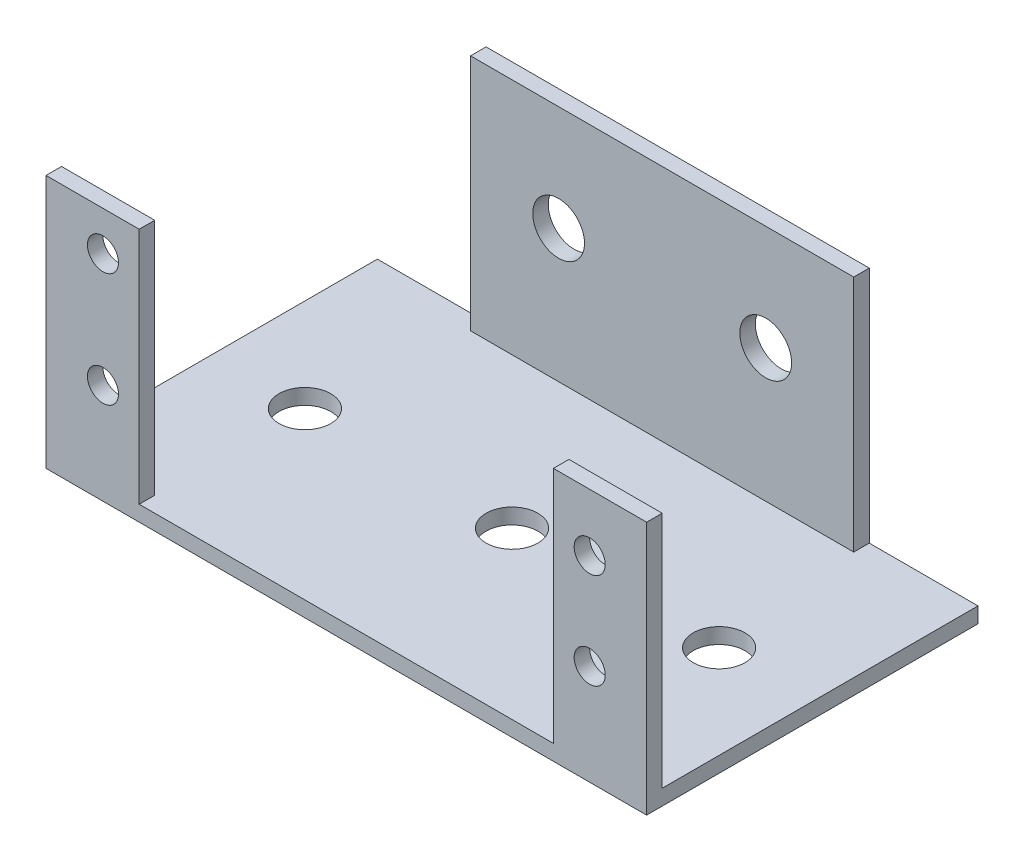
ISO-10303-21;
HEADER;
FILE_DESCRIPTION(('STEP AP214'),'2;1');
FILE_NAME('part.step','',(''),(''),'','','');
FILE_SCHEMA(('AUTOMOTIVE_DESIGN { 1 0 10303 214 1 1 1 1 }'));
ENDSEC;
DATA;
#1=APPLICATION_CONTEXT('core data for automotive mechanical design processes');
#2=APPLICATION_PROTOCOL_DEFINITION('international standard','automotive_design',2000,#1);
#3=PRODUCT_CONTEXT('',#1,'mechanical');
#4=PRODUCT('Part','Part','',(#3));
#5=PRODUCT_RELATED_PRODUCT_CATEGORY('part','',(#4));
#6=PRODUCT_DEFINITION_FORMATION('','',#4);
#7=PRODUCT_DEFINITION_CONTEXT('part definition',#1,'design');
#8=PRODUCT_DEFINITION('design','',#6,#7);
#9=PRODUCT_DEFINITION_SHAPE('','',#8);
#10=(LENGTH_UNIT() NAMED_UNIT(*) SI_UNIT(.MILLI.,.METRE.));
#11=(NAMED_UNIT(*) PLANE_ANGLE_UNIT() SI_UNIT($,.RADIAN.));
#12=(NAMED_UNIT(*) SI_UNIT($,.STERADIAN.) SOLID_ANGLE_UNIT());
#13=UNCERTAINTY_MEASURE_WITH_UNIT(LENGTH_MEASURE(1.E-05),#10,'distance_accuracy_value','');
#14=(GEOMETRIC_REPRESENTATION_CONTEXT(3) GLOBAL_UNCERTAINTY_ASSIGNED_CONTEXT((#13)) GLOBAL_UNIT_ASSIGNED_CONTEXT((#10,
#11,#12)) REPRESENTATION_CONTEXT('',''));
#15=CARTESIAN_POINT('',(0.,0.,0.));
#16=DIRECTION('',(0.,0.,1.));
#17=DIRECTION('',(1.,0.,0.));
#18=AXIS2_PLACEMENT_3D('',#15,#16,#17);
#19=CARTESIAN_POINT('',(0.,0.,0.));
#20=DIRECTION('',(0.,1.,0.));
#21=DIRECTION('',(0.,0.,1.));
#22=AXIS2_PLACEMENT_3D('',#19,#20,#21);
#23=PLANE('',#22);
#24=CARTESIAN_POINT('',(20.,0.,0.));
#25=DIRECTION('',(0.,1.,0.));
#26=DIRECTION('',(0.,0.,1.));
#27=AXIS2_PLACEMENT_3D('',#24,#25,#26);
#28=CIRCLE('',#27,2.5);
#29=CARTESIAN_POINT('',(20.,0.,2.5));
#30=VERTEX_POINT('',#29);
#31=EDGE_CURVE('E305',#30,#30,#28,.T.);
#32=ORIENTED_EDGE('',*,*,#31,.F.);
#33=EDGE_LOOP('',(#32));
#34=FACE_BOUND('',#33,.T.);
#35=CARTESIAN_POINT('',(0.,0.,0.));
#36=DIRECTION('',(0.,1.,0.));
#37=DIRECTION('',(0.,0.,1.));
#38=AXIS2_PLACEMENT_3D('',#35,#36,#37);
#39=CIRCLE('',#38,2.5);
#40=CARTESIAN_POINT('',(0.,0.,2.5));
#41=VERTEX_POINT('',#40);
#42=EDGE_CURVE('E562',#41,#41,#39,.T.);
#43=ORIENTED_EDGE('',*,*,#42,.F.);
#44=EDGE_LOOP('',(#43));
#45=FACE_BOUND('',#44,.T.);
#46=CARTESIAN_POINT('',(-20.,0.,0.));
#47=DIRECTION('',(0.,1.,0.));
#48=DIRECTION('',(0.,0.,1.));
#49=AXIS2_PLACEMENT_3D('',#46,#47,#48);
#50=CIRCLE('',#49,2.5);
#51=CARTESIAN_POINT('',(-20.,0.,2.5));
#52=VERTEX_POINT('',#51);
#53=EDGE_CURVE('E565',#52,#52,#50,.T.);
#54=ORIENTED_EDGE('',*,*,#53,.F.);
#55=EDGE_LOOP('',(#54));
#56=FACE_BOUND('',#55,.T.);
#57=DIRECTION('',(-1.,0.,0.));
#58=VECTOR('',#57,1.);
#59=CARTESIAN_POINT('',(0.,0.,-14.5));
#60=LINE('',#59,#58);
#61=CARTESIAN_POINT('',(18.5,0.,-14.5));
#62=VERTEX_POINT('',#61);
#63=CARTESIAN_POINT('',(-18.5,0.,-14.5));
#64=VERTEX_POINT('',#63);
#65=EDGE_CURVE('E88',#62,#64,#60,.T.);
#66=ORIENTED_EDGE('',*,*,#65,.T.);
#67=DIRECTION('',(0.,0.,1.));
#68=VECTOR('',#67,1.);
#69=CARTESIAN_POINT('',(-18.5,0.,0.));
#70=LINE('',#69,#68);
#71=CARTESIAN_POINT('',(-18.5,0.,-16.));
#72=VERTEX_POINT('',#71);
#73=EDGE_CURVE('E326',#72,#64,#70,.T.);
#74=ORIENTED_EDGE('',*,*,#73,.F.);
#75=DIRECTION('',(-1.,0.,0.));
#76=VECTOR('',#75,1.);
#77=CARTESIAN_POINT('',(0.,0.,-16.));
#78=LINE('',#77,#76);
#79=CARTESIAN_POINT('',(-29.,0.,-16.));
#80=VERTEX_POINT('',#79);
#81=EDGE_CURVE('E197',#72,#80,#78,.T.);
#82=ORIENTED_EDGE('',*,*,#81,.T.);
#83=DIRECTION('',(0.,0.,1.));
#84=VECTOR('',#83,1.);
#85=CARTESIAN_POINT('',(-29.,0.,0.));
#86=LINE('',#85,#84);
#87=CARTESIAN_POINT('',(-29.,0.,14.5));
#88=VERTEX_POINT('',#87);
#89=EDGE_CURVE('E285',#80,#88,#86,.T.);
#90=ORIENTED_EDGE('',*,*,#89,.T.);
#91=DIRECTION('',(1.,0.,0.));
#92=VECTOR('',#91,1.);
#93=CARTESIAN_POINT('',(0.,0.,14.5));
#94=LINE('',#93,#92);
#95=CARTESIAN_POINT('',(-20.,0.,14.5));
#96=VERTEX_POINT('',#95);
#97=EDGE_CURVE('E245',#88,#96,#94,.T.);
#98=ORIENTED_EDGE('',*,*,#97,.T.);
#99=DIRECTION('',(0.,0.,1.));
#100=VECTOR('',#99,1.);
#101=CARTESIAN_POINT('',(-20.,0.,0.));
#102=LINE('',#101,#100);
#103=CARTESIAN_POINT('',(-20.,0.,16.));
#104=VERTEX_POINT('',#103);
#105=EDGE_CURVE('E240',#96,#104,#102,.T.);
#106=ORIENTED_EDGE('',*,*,#105,.T.);
#107=DIRECTION('',(-1.,0.,0.));
#108=VECTOR('',#107,1.);
#109=CARTESIAN_POINT('',(0.,0.,16.));
#110=LINE('',#109,#108);
#111=CARTESIAN_POINT('',(20.,0.,16.));
#112=VERTEX_POINT('',#111);
#113=EDGE_CURVE('E271',#112,#104,#110,.T.);
#114=ORIENTED_EDGE('',*,*,#113,.F.);
#115=DIRECTION('',(0.,0.,1.));
#116=VECTOR('',#115,1.);
#117=CARTESIAN_POINT('',(20.,0.,0.));
#118=LINE('',#117,#116);
#119=CARTESIAN_POINT('',(20.,0.,14.5));
#120=VERTEX_POINT('',#119);
#121=EDGE_CURVE('E220',#120,#112,#118,.T.);
#122=ORIENTED_EDGE('',*,*,#121,.F.);
#123=DIRECTION('',(1.,0.,0.));
#124=VECTOR('',#123,1.);
#125=CARTESIAN_POINT('',(0.,0.,14.5));
#126=LINE('',#125,#124);
#127=CARTESIAN_POINT('',(29.,0.,14.5));
#128=VERTEX_POINT('',#127);
#129=EDGE_CURVE('E229',#120,#128,#126,.T.);
#130=ORIENTED_EDGE('',*,*,#129,.T.);
#131=DIRECTION('',(0.,0.,1.));
#132=VECTOR('',#131,1.);
#133=CARTESIAN_POINT('',(29.,0.,0.));
#134=LINE('',#133,#132);
#135=CARTESIAN_POINT('',(29.,0.,-16.));
#136=VERTEX_POINT('',#135);
#137=EDGE_CURVE('E279',#136,#128,#134,.T.);
#138=ORIENTED_EDGE('',*,*,#137,.F.);
#139=CARTESIAN_POINT('',(18.5,0.,-16.));
#140=VERTEX_POINT('',#139);
#141=EDGE_CURVE('E283',#136,#140,#78,.T.);
#142=ORIENTED_EDGE('',*,*,#141,.T.);
#143=DIRECTION('',(0.,0.,1.));
#144=VECTOR('',#143,1.);
#145=CARTESIAN_POINT('',(18.4999999999999,0.,1.28369537222284E-13));
#146=LINE('',#145,#144);
#147=EDGE_CURVE('E93',#140,#62,#146,.T.);
#148=ORIENTED_EDGE('',*,*,#147,.T.);
#149=EDGE_LOOP('',(#66,#74,#82,#90,#98,#106,#114,#122,#130,#138,#142,#148));
#150=FACE_BOUND('',#149,.T.);
#151=ADVANCED_FACE('F71',(#34,#45,#56,#150),#23,.T.);
#152=CARTESIAN_POINT('',(29.,-1.5,0.));
#153=DIRECTION('',(-1.,0.,0.));
#154=DIRECTION('',(0.,0.,1.));
#155=AXIS2_PLACEMENT_3D('',#152,#153,#154);
#156=PLANE('',#155);
#157=ORIENTED_EDGE('',*,*,#137,.T.);
#158=DIRECTION('',(0.,-1.,0.));
#159=VECTOR('',#158,1.);
#160=CARTESIAN_POINT('',(29.,23.,14.5));
#161=LINE('',#160,#159);
#162=CARTESIAN_POINT('',(29.,23.,14.5));
#163=VERTEX_POINT('',#162);
#164=EDGE_CURVE('E228',#163,#128,#161,.T.);
#165=ORIENTED_EDGE('',*,*,#164,.F.);
#166=DIRECTION('',(0.,0.,1.));
#167=VECTOR('',#166,1.);
#168=CARTESIAN_POINT('',(29.,23.,0.));
#169=LINE('',#168,#167);
#170=CARTESIAN_POINT('',(29.,23.,16.));
#171=VERTEX_POINT('',#170);
#172=EDGE_CURVE('E225',#163,#171,#169,.T.);
#173=ORIENTED_EDGE('',*,*,#172,.T.);
#174=DIRECTION('',(0.,1.,0.));
#175=VECTOR('',#174,1.);
#176=CARTESIAN_POINT('',(29.,-1.5,16.));
#177=LINE('',#176,#175);
#178=CARTESIAN_POINT('',(29.,-1.5,16.));
#179=VERTEX_POINT('',#178);
#180=EDGE_CURVE('E266',#179,#171,#177,.T.);
#181=ORIENTED_EDGE('',*,*,#180,.F.);
#182=DIRECTION('',(0.,0.,1.));
#183=VECTOR('',#182,1.);
#184=CARTESIAN_POINT('',(29.,-1.5,0.));
#185=LINE('',#184,#183);
#186=CARTESIAN_POINT('',(29.,-1.5,-16.));
#187=VERTEX_POINT('',#186);
#188=EDGE_CURVE('E267',#187,#179,#185,.T.);
#189=ORIENTED_EDGE('',*,*,#188,.F.);
#190=DIRECTION('',(0.,1.,0.));
#191=VECTOR('',#190,1.);
#192=CARTESIAN_POINT('',(29.,-1.5,-16.));
#193=LINE('',#192,#191);
#194=EDGE_CURVE('E80',#187,#136,#193,.T.);
#195=ORIENTED_EDGE('',*,*,#194,.T.);
#196=EDGE_LOOP('',(#157,#165,#173,#181,#189,#195));
#197=FACE_BOUND('',#196,.T.);
#198=ADVANCED_FACE('F73',(#197),#156,.F.);
#199=CARTESIAN_POINT('',(0.,-1.5,-16.));
#200=DIRECTION('',(0.,0.,-1.));
#201=DIRECTION('',(-1.,0.,0.));
#202=AXIS2_PLACEMENT_3D('',#199,#200,#201);
#203=PLANE('',#202);
#204=CARTESIAN_POINT('',(10.,12.8220392959266,-16.));
#205=DIRECTION('',(0.,0.,1.));
#206=DIRECTION('',(1.,0.,0.));
#207=AXIS2_PLACEMENT_3D('',#204,#205,#206);
#208=CIRCLE('',#207,2.5);
#209=CARTESIAN_POINT('',(12.5,12.8220392959266,-16.));
#210=VERTEX_POINT('',#209);
#211=EDGE_CURVE('E328',#210,#210,#208,.T.);
#212=ORIENTED_EDGE('',*,*,#211,.T.);
#213=EDGE_LOOP('',(#212));
#214=FACE_BOUND('',#213,.T.);
#215=CARTESIAN_POINT('',(-10.,12.8220392959266,-16.));
#216=DIRECTION('',(0.,0.,1.));
#217=DIRECTION('',(-1.,0.,0.));
#218=AXIS2_PLACEMENT_3D('',#215,#216,#217);
#219=CIRCLE('',#218,2.5);
#220=CARTESIAN_POINT('',(-7.5,12.8220392959266,-16.));
#221=VERTEX_POINT('',#220);
#222=EDGE_CURVE('E314',#221,#221,#219,.T.);
#223=ORIENTED_EDGE('',*,*,#222,.T.);
#224=EDGE_LOOP('',(#223));
#225=FACE_BOUND('',#224,.T.);
#226=ORIENTED_EDGE('',*,*,#141,.F.);
#227=ORIENTED_EDGE('',*,*,#194,.F.);
#228=DIRECTION('',(-1.,0.,0.));
#229=VECTOR('',#228,1.);
#230=CARTESIAN_POINT('',(0.,-1.5,-16.));
#231=LINE('',#230,#229);
#232=CARTESIAN_POINT('',(-29.,-1.5,-16.));
#233=VERTEX_POINT('',#232);
#234=EDGE_CURVE('E270',#187,#233,#231,.T.);
#235=ORIENTED_EDGE('',*,*,#234,.T.);
#236=DIRECTION('',(0.,1.,0.));
#237=VECTOR('',#236,1.);
#238=CARTESIAN_POINT('',(-29.,-1.5,-16.));
#239=LINE('',#238,#237);
#240=EDGE_CURVE('E12',#233,#80,#239,.T.);
#241=ORIENTED_EDGE('',*,*,#240,.T.);
#242=ORIENTED_EDGE('',*,*,#81,.F.);
#243=DIRECTION('',(0.,-1.,0.));
#244=VECTOR('',#243,1.);
#245=CARTESIAN_POINT('',(-18.5,23.,-16.));
#246=LINE('',#245,#244);
#247=CARTESIAN_POINT('',(-18.5,23.,-16.));
#248=VERTEX_POINT('',#247);
#249=EDGE_CURVE('E179',#248,#72,#246,.T.);
#250=ORIENTED_EDGE('',*,*,#249,.F.);
#251=DIRECTION('',(-1.,0.,0.));
#252=VECTOR('',#251,1.);
#253=CARTESIAN_POINT('',(0.,23.,-16.));
#254=LINE('',#253,#252);
#255=CARTESIAN_POINT('',(18.5,23.,-16.));
#256=VERTEX_POINT('',#255);
#257=EDGE_CURVE('E185',#256,#248,#254,.T.);
#258=ORIENTED_EDGE('',*,*,#257,.F.);
#259=DIRECTION('',(0.,-1.,0.));
#260=VECTOR('',#259,1.);
#261=CARTESIAN_POINT('',(18.5,23.,-16.));
#262=LINE('',#261,#260);
#263=EDGE_CURVE('E325',#256,#140,#262,.T.);
#264=ORIENTED_EDGE('',*,*,#263,.T.);
#265=EDGE_LOOP('',(#226,#227,#235,#241,#242,#250,#258,#264));
#266=FACE_BOUND('',#265,.T.);
#267=ADVANCED_FACE('F196',(#214,#225,#266),#203,.T.);
#268=CARTESIAN_POINT('',(-29.,-1.5,0.));
#269=DIRECTION('',(-1.,0.,0.));
#270=DIRECTION('',(0.,0.,1.));
#271=AXIS2_PLACEMENT_3D('',#268,#269,#270);
#272=PLANE('',#271);
#273=ORIENTED_EDGE('',*,*,#89,.F.);
#274=ORIENTED_EDGE('',*,*,#240,.F.);
#275=DIRECTION('',(0.,0.,1.));
#276=VECTOR('',#275,1.);
#277=CARTESIAN_POINT('',(-29.,-1.5,0.));
#278=LINE('',#277,#276);
#279=CARTESIAN_POINT('',(-29.,-1.5,16.));
#280=VERTEX_POINT('',#279);
#281=EDGE_CURVE('E274',#233,#280,#278,.T.);
#282=ORIENTED_EDGE('',*,*,#281,.T.);
#283=DIRECTION('',(0.,1.,0.));
#284=VECTOR('',#283,1.);
#285=CARTESIAN_POINT('',(-29.,-1.5,16.));
#286=LINE('',#285,#284);
#287=CARTESIAN_POINT('',(-29.,23.,16.));
#288=VERTEX_POINT('',#287);
#289=EDGE_CURVE('E282',#280,#288,#286,.T.);
#290=ORIENTED_EDGE('',*,*,#289,.T.);
#291=DIRECTION('',(0.,0.,1.));
#292=VECTOR('',#291,1.);
#293=CARTESIAN_POINT('',(-29.,23.,0.));
#294=LINE('',#293,#292);
#295=CARTESIAN_POINT('',(-29.,23.,14.5));
#296=VERTEX_POINT('',#295);
#297=EDGE_CURVE('E248',#296,#288,#294,.T.);
#298=ORIENTED_EDGE('',*,*,#297,.F.);
#299=DIRECTION('',(0.,-1.,0.));
#300=VECTOR('',#299,1.);
#301=CARTESIAN_POINT('',(-29.,23.,14.5));
#302=LINE('',#301,#300);
#303=EDGE_CURVE('E261',#296,#88,#302,.T.);
#304=ORIENTED_EDGE('',*,*,#303,.T.);
#305=EDGE_LOOP('',(#273,#274,#282,#290,#298,#304));
#306=FACE_BOUND('',#305,.T.);
#307=ADVANCED_FACE('F339',(#306),#272,.T.);
#308=CARTESIAN_POINT('',(0.,-1.5,16.));
#309=DIRECTION('',(0.,0.,-1.));
#310=DIRECTION('',(-1.,0.,0.));
#311=AXIS2_PLACEMENT_3D('',#308,#309,#310);
#312=PLANE('',#311);
#313=CARTESIAN_POINT('',(-23.5,8.1974878238588,16.));
#314=DIRECTION('',(0.,0.,1.));
#315=DIRECTION('',(1.,0.,0.));
#316=AXIS2_PLACEMENT_3D('',#313,#314,#315);
#317=CIRCLE('',#316,1.5);
#318=CARTESIAN_POINT('',(-22.,8.1974878238588,16.));
#319=VERTEX_POINT('',#318);
#320=EDGE_CURVE('E207',#319,#319,#317,.T.);
#321=ORIENTED_EDGE('',*,*,#320,.F.);
#322=EDGE_LOOP('',(#321));
#323=FACE_BOUND('',#322,.T.);
#324=CARTESIAN_POINT('',(23.5,17.4465907679944,16.));
#325=DIRECTION('',(0.,0.,1.));
#326=DIRECTION('',(1.,0.,0.));
#327=AXIS2_PLACEMENT_3D('',#324,#325,#326);
#328=CIRCLE('',#327,1.5);
#329=CARTESIAN_POINT('',(25.,17.4465907679944,16.));
#330=VERTEX_POINT('',#329);
#331=EDGE_CURVE('E201',#330,#330,#328,.T.);
#332=ORIENTED_EDGE('',*,*,#331,.F.);
#333=EDGE_LOOP('',(#332));
#334=FACE_BOUND('',#333,.T.);
#335=CARTESIAN_POINT('',(23.5,8.1974878238588,16.));
#336=DIRECTION('',(0.,0.,1.));
#337=DIRECTION('',(1.,0.,0.));
#338=AXIS2_PLACEMENT_3D('',#335,#336,#337);
#339=CIRCLE('',#338,1.5);
#340=CARTESIAN_POINT('',(25.,8.1974878238588,16.));
#341=VERTEX_POINT('',#340);
#342=EDGE_CURVE('E198',#341,#341,#339,.T.);
#343=ORIENTED_EDGE('',*,*,#342,.F.);
#344=EDGE_LOOP('',(#343));
#345=FACE_BOUND('',#344,.T.);
#346=CARTESIAN_POINT('',(-23.5,19.1974878238588,16.));
#347=DIRECTION('',(0.,0.,1.));
#348=DIRECTION('',(1.,0.,0.));
#349=AXIS2_PLACEMENT_3D('',#346,#347,#348);
#350=CIRCLE('',#349,1.5);
#351=CARTESIAN_POINT('',(-22.,19.1974878238588,16.));
#352=VERTEX_POINT('',#351);
#353=EDGE_CURVE('E210',#352,#352,#350,.T.);
#354=ORIENTED_EDGE('',*,*,#353,.F.);
#355=EDGE_LOOP('',(#354));
#356=FACE_BOUND('',#355,.T.);
#357=ORIENTED_EDGE('',*,*,#180,.T.);
#358=DIRECTION('',(-1.,0.,0.));
#359=VECTOR('',#358,1.);
#360=CARTESIAN_POINT('',(0.,23.,16.));
#361=LINE('',#360,#359);
#362=CARTESIAN_POINT('',(20.,23.,16.));
#363=VERTEX_POINT('',#362);
#364=EDGE_CURVE('E222',#171,#363,#361,.T.);
#365=ORIENTED_EDGE('',*,*,#364,.T.);
#366=DIRECTION('',(0.,-1.,0.));
#367=VECTOR('',#366,1.);
#368=CARTESIAN_POINT('',(20.,23.,16.));
#369=LINE('',#368,#367);
#370=EDGE_CURVE('E235',#363,#112,#369,.T.);
#371=ORIENTED_EDGE('',*,*,#370,.T.);
#372=ORIENTED_EDGE('',*,*,#113,.T.);
#373=DIRECTION('',(0.,-1.,0.));
#374=VECTOR('',#373,1.);
#375=CARTESIAN_POINT('',(-20.,23.,16.));
#376=LINE('',#375,#374);
#377=CARTESIAN_POINT('',(-20.,23.,16.));
#378=VERTEX_POINT('',#377);
#379=EDGE_CURVE('E254',#378,#104,#376,.T.);
#380=ORIENTED_EDGE('',*,*,#379,.F.);
#381=DIRECTION('',(-1.,0.,0.));
#382=VECTOR('',#381,1.);
#383=CARTESIAN_POINT('',(0.,23.,16.));
#384=LINE('',#383,#382);
#385=EDGE_CURVE('E251',#378,#288,#384,.T.);
#386=ORIENTED_EDGE('',*,*,#385,.T.);
#387=ORIENTED_EDGE('',*,*,#289,.F.);
#388=DIRECTION('',(-1.,0.,0.));
#389=VECTOR('',#388,1.);
#390=CARTESIAN_POINT('',(0.,-1.5,16.));
#391=LINE('',#390,#389);
#392=EDGE_CURVE('E276',#179,#280,#391,.T.);
#393=ORIENTED_EDGE('',*,*,#392,.F.);
#394=EDGE_LOOP('',(#357,#365,#371,#372,#380,#386,#387,#393));
#395=FACE_BOUND('',#394,.T.);
#396=ADVANCED_FACE('F352',(#323,#334,#345,#356,#395),#312,.F.);
#397=CARTESIAN_POINT('',(0.,-1.5,0.));
#398=DIRECTION('',(0.,1.,0.));
#399=DIRECTION('',(0.,0.,1.));
#400=AXIS2_PLACEMENT_3D('',#397,#398,#399);
#401=PLANE('',#400);
#402=CARTESIAN_POINT('',(20.,-1.5,0.));
#403=DIRECTION('',(0.,1.,0.));
#404=DIRECTION('',(0.,0.,1.));
#405=AXIS2_PLACEMENT_3D('',#402,#403,#404);
#406=CIRCLE('',#405,2.5);
#407=CARTESIAN_POINT('',(20.,-1.5,2.5));
#408=VERTEX_POINT('',#407);
#409=EDGE_CURVE('E75',#408,#408,#406,.T.);
#410=ORIENTED_EDGE('',*,*,#409,.T.);
#411=EDGE_LOOP('',(#410));
#412=FACE_BOUND('',#411,.T.);
#413=CARTESIAN_POINT('',(0.,-1.5,0.));
#414=DIRECTION('',(0.,1.,0.));
#415=DIRECTION('',(0.,0.,1.));
#416=AXIS2_PLACEMENT_3D('',#413,#414,#415);
#417=CIRCLE('',#416,2.5);
#418=CARTESIAN_POINT('',(0.,-1.5,2.5));
#419=VERTEX_POINT('',#418);
#420=EDGE_CURVE('E304',#419,#419,#417,.T.);
#421=ORIENTED_EDGE('',*,*,#420,.T.);
#422=EDGE_LOOP('',(#421));
#423=FACE_BOUND('',#422,.T.);
#424=CARTESIAN_POINT('',(-20.,-1.5,0.));
#425=DIRECTION('',(0.,1.,0.));
#426=DIRECTION('',(0.,0.,1.));
#427=AXIS2_PLACEMENT_3D('',#424,#425,#426);
#428=CIRCLE('',#427,2.5);
#429=CARTESIAN_POINT('',(-20.,-1.5,2.5));
#430=VERTEX_POINT('',#429);
#431=EDGE_CURVE('E302',#430,#430,#428,.T.);
#432=ORIENTED_EDGE('',*,*,#431,.T.);
#433=EDGE_LOOP('',(#432));
#434=FACE_BOUND('',#433,.T.);
#435=ORIENTED_EDGE('',*,*,#188,.T.);
#436=ORIENTED_EDGE('',*,*,#392,.T.);
#437=ORIENTED_EDGE('',*,*,#281,.F.);
#438=ORIENTED_EDGE('',*,*,#234,.F.);
#439=EDGE_LOOP('',(#435,#436,#437,#438));
#440=FACE_BOUND('',#439,.T.);
#441=ADVANCED_FACE('F367',(#412,#423,#434,#440),#401,.F.);
#442=CARTESIAN_POINT('',(-20.,23.,0.));
#443=DIRECTION('',(1.,0.,0.));
#444=DIRECTION('',(0.,0.,-1.));
#445=AXIS2_PLACEMENT_3D('',#442,#443,#444);
#446=PLANE('',#445);
#447=ORIENTED_EDGE('',*,*,#105,.F.);
#448=DIRECTION('',(0.,-1.,0.));
#449=VECTOR('',#448,1.);
#450=CARTESIAN_POINT('',(-20.,23.,14.5));
#451=LINE('',#450,#449);
#452=CARTESIAN_POINT('',(-20.,23.,14.5));
#453=VERTEX_POINT('',#452);
#454=EDGE_CURVE('E263',#453,#96,#451,.T.);
#455=ORIENTED_EDGE('',*,*,#454,.F.);
#456=DIRECTION('',(0.,0.,1.));
#457=VECTOR('',#456,1.);
#458=CARTESIAN_POINT('',(-20.,23.,0.));
#459=LINE('',#458,#457);
#460=EDGE_CURVE('E241',#453,#378,#459,.T.);
#461=ORIENTED_EDGE('',*,*,#460,.T.);
#462=ORIENTED_EDGE('',*,*,#379,.T.);
#463=EDGE_LOOP('',(#447,#455,#461,#462));
#464=FACE_BOUND('',#463,.T.);
#465=ADVANCED_FACE('F348',(#464),#446,.T.);
#466=CARTESIAN_POINT('',(0.,23.,14.5));
#467=DIRECTION('',(0.,0.,-1.));
#468=DIRECTION('',(-1.,0.,0.));
#469=AXIS2_PLACEMENT_3D('',#466,#467,#468);
#470=PLANE('',#469);
#471=CARTESIAN_POINT('',(-23.5,8.1974878238588,14.5));
#472=DIRECTION('',(0.,0.,-1.));
#473=DIRECTION('',(-1.,0.,0.));
#474=AXIS2_PLACEMENT_3D('',#471,#472,#473);
#475=CIRCLE('',#474,1.5);
#476=CARTESIAN_POINT('',(-25.,8.1974878238588,14.5));
#477=VERTEX_POINT('',#476);
#478=EDGE_CURVE('E232',#477,#477,#475,.T.);
#479=ORIENTED_EDGE('',*,*,#478,.F.);
#480=EDGE_LOOP('',(#479));
#481=FACE_BOUND('',#480,.T.);
#482=CARTESIAN_POINT('',(-23.5,19.1974878238588,14.5));
#483=DIRECTION('',(0.,0.,-1.));
#484=DIRECTION('',(-1.,0.,0.));
#485=AXIS2_PLACEMENT_3D('',#482,#483,#484);
#486=CIRCLE('',#485,1.5);
#487=CARTESIAN_POINT('',(-25.,19.1974878238588,14.5));
#488=VERTEX_POINT('',#487);
#489=EDGE_CURVE('E297',#488,#488,#486,.T.);
#490=ORIENTED_EDGE('',*,*,#489,.F.);
#491=EDGE_LOOP('',(#490));
#492=FACE_BOUND('',#491,.T.);
#493=ORIENTED_EDGE('',*,*,#97,.F.);
#494=ORIENTED_EDGE('',*,*,#303,.F.);
#495=DIRECTION('',(1.,0.,0.));
#496=VECTOR('',#495,1.);
#497=CARTESIAN_POINT('',(0.,23.,14.5));
#498=LINE('',#497,#496);
#499=EDGE_CURVE('E244',#296,#453,#498,.T.);
#500=ORIENTED_EDGE('',*,*,#499,.T.);
#501=ORIENTED_EDGE('',*,*,#454,.T.);
#502=EDGE_LOOP('',(#493,#494,#500,#501));
#503=FACE_BOUND('',#502,.T.);
#504=ADVANCED_FACE('F344',(#481,#492,#503),#470,.T.);
#505=CARTESIAN_POINT('',(0.,23.,0.));
#506=DIRECTION('',(0.,1.,0.));
#507=DIRECTION('',(0.,0.,1.));
#508=AXIS2_PLACEMENT_3D('',#505,#506,#507);
#509=PLANE('',#508);
#510=ORIENTED_EDGE('',*,*,#460,.F.);
#511=ORIENTED_EDGE('',*,*,#499,.F.);
#512=ORIENTED_EDGE('',*,*,#297,.T.);
#513=ORIENTED_EDGE('',*,*,#385,.F.);
#514=EDGE_LOOP('',(#510,#511,#512,#513));
#515=FACE_BOUND('',#514,.T.);
#516=ADVANCED_FACE('F369',(#515),#509,.T.);
#517=CARTESIAN_POINT('',(0.,23.,14.5));
#518=DIRECTION('',(0.,0.,-1.));
#519=DIRECTION('',(-1.,0.,0.));
#520=AXIS2_PLACEMENT_3D('',#517,#518,#519);
#521=PLANE('',#520);
#522=CARTESIAN_POINT('',(23.5,17.4465907679944,14.5));
#523=DIRECTION('',(0.,0.,-1.));
#524=DIRECTION('',(-1.,0.,0.));
#525=AXIS2_PLACEMENT_3D('',#522,#523,#524);
#526=CIRCLE('',#525,1.5);
#527=CARTESIAN_POINT('',(22.,17.4465907679944,14.5));
#528=VERTEX_POINT('',#527);
#529=EDGE_CURVE('E294',#528,#528,#526,.T.);
#530=ORIENTED_EDGE('',*,*,#529,.F.);
#531=EDGE_LOOP('',(#530));
#532=FACE_BOUND('',#531,.T.);
#533=CARTESIAN_POINT('',(23.5,8.1974878238588,14.5));
#534=DIRECTION('',(0.,0.,-1.));
#535=DIRECTION('',(-1.,0.,0.));
#536=AXIS2_PLACEMENT_3D('',#533,#534,#535);
#537=CIRCLE('',#536,1.5);
#538=CARTESIAN_POINT('',(22.,8.1974878238588,14.5));
#539=VERTEX_POINT('',#538);
#540=EDGE_CURVE('E215',#539,#539,#537,.T.);
#541=ORIENTED_EDGE('',*,*,#540,.F.);
#542=EDGE_LOOP('',(#541));
#543=FACE_BOUND('',#542,.T.);
#544=ORIENTED_EDGE('',*,*,#129,.F.);
#545=DIRECTION('',(0.,-1.,0.));
#546=VECTOR('',#545,1.);
#547=CARTESIAN_POINT('',(20.,23.,14.5));
#548=LINE('',#547,#546);
#549=CARTESIAN_POINT('',(20.,23.,14.5));
#550=VERTEX_POINT('',#549);
#551=EDGE_CURVE('E238',#550,#120,#548,.T.);
#552=ORIENTED_EDGE('',*,*,#551,.F.);
#553=DIRECTION('',(1.,0.,0.));
#554=VECTOR('',#553,1.);
#555=CARTESIAN_POINT('',(0.,23.,14.5));
#556=LINE('',#555,#554);
#557=EDGE_CURVE('E216',#550,#163,#556,.T.);
#558=ORIENTED_EDGE('',*,*,#557,.T.);
#559=ORIENTED_EDGE('',*,*,#164,.T.);
#560=EDGE_LOOP('',(#544,#552,#558,#559));
#561=FACE_BOUND('',#560,.T.);
#562=ADVANCED_FACE('F371',(#532,#543,#561),#521,.T.);
#563=CARTESIAN_POINT('',(20.,23.,0.));
#564=DIRECTION('',(1.,0.,0.));
#565=DIRECTION('',(0.,0.,-1.));
#566=AXIS2_PLACEMENT_3D('',#563,#564,#565);
#567=PLANE('',#566);
#568=ORIENTED_EDGE('',*,*,#121,.T.);
#569=ORIENTED_EDGE('',*,*,#370,.F.);
#570=DIRECTION('',(0.,0.,1.));
#571=VECTOR('',#570,1.);
#572=CARTESIAN_POINT('',(20.,23.,0.));
#573=LINE('',#572,#571);
#574=EDGE_CURVE('E219',#550,#363,#573,.T.);
#575=ORIENTED_EDGE('',*,*,#574,.F.);
#576=ORIENTED_EDGE('',*,*,#551,.T.);
#577=EDGE_LOOP('',(#568,#569,#575,#576));
#578=FACE_BOUND('',#577,.T.);
#579=ADVANCED_FACE('F358',(#578),#567,.F.);
#580=CARTESIAN_POINT('',(0.,23.,0.));
#581=DIRECTION('',(0.,1.,0.));
#582=DIRECTION('',(0.,0.,1.));
#583=AXIS2_PLACEMENT_3D('',#580,#581,#582);
#584=PLANE('',#583);
#585=ORIENTED_EDGE('',*,*,#557,.F.);
#586=ORIENTED_EDGE('',*,*,#574,.T.);
#587=ORIENTED_EDGE('',*,*,#364,.F.);
#588=ORIENTED_EDGE('',*,*,#172,.F.);
#589=EDGE_LOOP('',(#585,#586,#587,#588));
#590=FACE_BOUND('',#589,.T.);
#591=ADVANCED_FACE('F431',(#590),#584,.T.);
#592=CARTESIAN_POINT('',(23.5,8.1974878238588,-16.));
#593=DIRECTION('',(0.,0.,1.));
#594=DIRECTION('',(1.,0.,0.));
#595=AXIS2_PLACEMENT_3D('',#592,#593,#594);
#596=CYLINDRICAL_SURFACE('',#595,1.5);
#597=ORIENTED_EDGE('',*,*,#540,.T.);
#598=EDGE_LOOP('',(#597));
#599=FACE_BOUND('',#598,.T.);
#600=ORIENTED_EDGE('',*,*,#342,.T.);
#601=EDGE_LOOP('',(#600));
#602=FACE_BOUND('',#601,.T.);
#603=ADVANCED_FACE('F427',(#599,#602),#596,.F.);
#604=CARTESIAN_POINT('',(23.5,17.4465907679944,-16.));
#605=DIRECTION('',(0.,0.,1.));
#606=DIRECTION('',(1.,0.,0.));
#607=AXIS2_PLACEMENT_3D('',#604,#605,#606);
#608=CYLINDRICAL_SURFACE('',#607,1.5);
#609=ORIENTED_EDGE('',*,*,#529,.T.);
#610=EDGE_LOOP('',(#609));
#611=FACE_BOUND('',#610,.T.);
#612=ORIENTED_EDGE('',*,*,#331,.T.);
#613=EDGE_LOOP('',(#612));
#614=FACE_BOUND('',#613,.T.);
#615=ADVANCED_FACE('F430',(#611,#614),#608,.F.);
#616=CARTESIAN_POINT('',(-23.5,19.1974878238588,-16.));
#617=DIRECTION('',(0.,0.,1.));
#618=DIRECTION('',(1.,0.,0.));
#619=AXIS2_PLACEMENT_3D('',#616,#617,#618);
#620=CYLINDRICAL_SURFACE('',#619,1.5);
#621=ORIENTED_EDGE('',*,*,#489,.T.);
#622=EDGE_LOOP('',(#621));
#623=FACE_BOUND('',#622,.T.);
#624=ORIENTED_EDGE('',*,*,#353,.T.);
#625=EDGE_LOOP('',(#624));
#626=FACE_BOUND('',#625,.T.);
#627=ADVANCED_FACE('F435',(#623,#626),#620,.F.);
#628=CARTESIAN_POINT('',(-23.5,8.1974878238588,-16.));
#629=DIRECTION('',(0.,0.,1.));
#630=DIRECTION('',(1.,0.,0.));
#631=AXIS2_PLACEMENT_3D('',#628,#629,#630);
#632=CYLINDRICAL_SURFACE('',#631,1.5);
#633=ORIENTED_EDGE('',*,*,#478,.T.);
#634=EDGE_LOOP('',(#633));
#635=FACE_BOUND('',#634,.T.);
#636=ORIENTED_EDGE('',*,*,#320,.T.);
#637=EDGE_LOOP('',(#636));
#638=FACE_BOUND('',#637,.T.);
#639=ADVANCED_FACE('F426',(#635,#638),#632,.F.);
#640=CARTESIAN_POINT('',(-18.5,23.,0.));
#641=DIRECTION('',(1.,0.,0.));
#642=DIRECTION('',(0.,0.,-1.));
#643=AXIS2_PLACEMENT_3D('',#640,#641,#642);
#644=PLANE('',#643);
#645=ORIENTED_EDGE('',*,*,#73,.T.);
#646=DIRECTION('',(0.,-1.,0.));
#647=VECTOR('',#646,1.);
#648=CARTESIAN_POINT('',(-18.5,23.,-14.5));
#649=LINE('',#648,#647);
#650=CARTESIAN_POINT('',(-18.5,23.,-14.5));
#651=VERTEX_POINT('',#650);
#652=EDGE_CURVE('E180',#651,#64,#649,.T.);
#653=ORIENTED_EDGE('',*,*,#652,.F.);
#654=DIRECTION('',(0.,0.,1.));
#655=VECTOR('',#654,1.);
#656=CARTESIAN_POINT('',(-18.5,23.,0.));
#657=LINE('',#656,#655);
#658=EDGE_CURVE('E174',#248,#651,#657,.T.);
#659=ORIENTED_EDGE('',*,*,#658,.F.);
#660=ORIENTED_EDGE('',*,*,#249,.T.);
#661=EDGE_LOOP('',(#645,#653,#659,#660));
#662=FACE_BOUND('',#661,.T.);
#663=ADVANCED_FACE('F177',(#662),#644,.F.);
#664=CARTESIAN_POINT('',(0.,23.,-14.5));
#665=DIRECTION('',(0.,0.,1.));
#666=DIRECTION('',(1.,0.,0.));
#667=AXIS2_PLACEMENT_3D('',#664,#665,#666);
#668=PLANE('',#667);
#669=CARTESIAN_POINT('',(10.,12.8220392959266,-14.5));
#670=DIRECTION('',(0.,0.,1.));
#671=DIRECTION('',(1.,0.,0.));
#672=AXIS2_PLACEMENT_3D('',#669,#670,#671);
#673=CIRCLE('',#672,2.5);
#674=CARTESIAN_POINT('',(12.5,12.8220392959266,-14.5));
#675=VERTEX_POINT('',#674);
#676=EDGE_CURVE('E319',#675,#675,#673,.T.);
#677=ORIENTED_EDGE('',*,*,#676,.F.);
#678=EDGE_LOOP('',(#677));
#679=FACE_BOUND('',#678,.T.);
#680=CARTESIAN_POINT('',(-10.,12.8220392959266,-14.5));
#681=DIRECTION('',(0.,0.,1.));
#682=DIRECTION('',(-1.,0.,0.));
#683=AXIS2_PLACEMENT_3D('',#680,#681,#682);
#684=CIRCLE('',#683,2.5);
#685=CARTESIAN_POINT('',(-7.5,12.8220392959266,-14.5));
#686=VERTEX_POINT('',#685);
#687=EDGE_CURVE('E310',#686,#686,#684,.T.);
#688=ORIENTED_EDGE('',*,*,#687,.F.);
#689=EDGE_LOOP('',(#688));
#690=FACE_BOUND('',#689,.T.);
#691=ORIENTED_EDGE('',*,*,#65,.F.);
#692=DIRECTION('',(0.,-1.,0.));
#693=VECTOR('',#692,1.);
#694=CARTESIAN_POINT('',(18.5,23.,-14.5));
#695=LINE('',#694,#693);
#696=CARTESIAN_POINT('',(18.5,23.,-14.5));
#697=VERTEX_POINT('',#696);
#698=EDGE_CURVE('E203',#697,#62,#695,.T.);
#699=ORIENTED_EDGE('',*,*,#698,.F.);
#700=DIRECTION('',(-1.,0.,0.));
#701=VECTOR('',#700,1.);
#702=CARTESIAN_POINT('',(0.,23.,-14.5));
#703=LINE('',#702,#701);
#704=EDGE_CURVE('E184',#697,#651,#703,.T.);
#705=ORIENTED_EDGE('',*,*,#704,.T.);
#706=ORIENTED_EDGE('',*,*,#652,.T.);
#707=EDGE_LOOP('',(#691,#699,#705,#706));
#708=FACE_BOUND('',#707,.T.);
#709=ADVANCED_FACE('F334',(#679,#690,#708),#668,.T.);
#710=CARTESIAN_POINT('',(18.4999999999999,23.,1.28369537222284E-13));
#711=DIRECTION('',(1.,0.,0.));
#712=DIRECTION('',(0.,0.,-1.));
#713=AXIS2_PLACEMENT_3D('',#710,#711,#712);
#714=PLANE('',#713);
#715=ORIENTED_EDGE('',*,*,#147,.F.);
#716=ORIENTED_EDGE('',*,*,#263,.F.);
#717=DIRECTION('',(0.,0.,1.));
#718=VECTOR('',#717,1.);
#719=CARTESIAN_POINT('',(18.4999999999999,23.,1.28369537222284E-13));
#720=LINE('',#719,#718);
#721=EDGE_CURVE('E191',#256,#697,#720,.T.);
#722=ORIENTED_EDGE('',*,*,#721,.T.);
#723=ORIENTED_EDGE('',*,*,#698,.T.);
#724=EDGE_LOOP('',(#715,#716,#722,#723));
#725=FACE_BOUND('',#724,.T.);
#726=ADVANCED_FACE('F332',(#725),#714,.T.);
#727=CARTESIAN_POINT('',(0.,23.,0.));
#728=DIRECTION('',(0.,1.,0.));
#729=DIRECTION('',(0.,0.,1.));
#730=AXIS2_PLACEMENT_3D('',#727,#728,#729);
#731=PLANE('',#730);
#732=ORIENTED_EDGE('',*,*,#257,.T.);
#733=ORIENTED_EDGE('',*,*,#658,.T.);
#734=ORIENTED_EDGE('',*,*,#704,.F.);
#735=ORIENTED_EDGE('',*,*,#721,.F.);
#736=EDGE_LOOP('',(#732,#733,#734,#735));
#737=FACE_BOUND('',#736,.T.);
#738=ADVANCED_FACE('F189',(#737),#731,.T.);
#739=CARTESIAN_POINT('',(-10.,12.8220392959266,-16.));
#740=DIRECTION('',(0.,0.,1.));
#741=DIRECTION('',(1.,0.,0.));
#742=AXIS2_PLACEMENT_3D('',#739,#740,#741);
#743=CYLINDRICAL_SURFACE('',#742,2.5);
#744=CARTESIAN_POINT('',(-7.5,12.8220392959266,-16.));
#745=CARTESIAN_POINT('',(-7.5,12.8220392959266,-15.984375));
#746=CARTESIAN_POINT('',(-7.5,12.8220392959266,-15.96875));
#747=CARTESIAN_POINT('',(-7.5,12.8220392959266,-15.9375));
#748=CARTESIAN_POINT('',(-7.5,12.8220392959266,-15.921875));
#749=CARTESIAN_POINT('',(-7.5,12.8220392959266,-15.890625));
#750=CARTESIAN_POINT('',(-7.5,12.8220392959266,-15.875));
#751=CARTESIAN_POINT('',(-7.5,12.8220392959266,-15.84375));
#752=CARTESIAN_POINT('',(-7.5,12.8220392959266,-15.828125));
#753=CARTESIAN_POINT('',(-7.5,12.8220392959266,-15.796875));
#754=CARTESIAN_POINT('',(-7.5,12.8220392959266,-15.78125));
#755=CARTESIAN_POINT('',(-7.5,12.8220392959266,-15.75));
#756=CARTESIAN_POINT('',(-7.5,12.8220392959266,-15.734375));
#757=CARTESIAN_POINT('',(-7.5,12.8220392959266,-15.703125));
#758=CARTESIAN_POINT('',(-7.5,12.8220392959266,-15.6875));
#759=CARTESIAN_POINT('',(-7.5,12.8220392959266,-15.65625));
#760=CARTESIAN_POINT('',(-7.5,12.8220392959266,-15.640625));
#761=CARTESIAN_POINT('',(-7.5,12.8220392959266,-15.609375));
#762=CARTESIAN_POINT('',(-7.5,12.8220392959266,-15.59375));
#763=CARTESIAN_POINT('',(-7.5,12.8220392959266,-15.5625));
#764=CARTESIAN_POINT('',(-7.5,12.8220392959266,-15.546875));
#765=CARTESIAN_POINT('',(-7.5,12.8220392959266,-15.515625));
#766=CARTESIAN_POINT('',(-7.5,12.8220392959266,-15.5));
#767=CARTESIAN_POINT('',(-7.5,12.8220392959266,-15.46875));
#768=CARTESIAN_POINT('',(-7.5,12.8220392959266,-15.453125));
#769=CARTESIAN_POINT('',(-7.5,12.8220392959266,-15.421875));
#770=CARTESIAN_POINT('',(-7.5,12.8220392959266,-15.40625));
#771=CARTESIAN_POINT('',(-7.5,12.8220392959266,-15.375));
#772=CARTESIAN_POINT('',(-7.5,12.8220392959266,-15.359375));
#773=CARTESIAN_POINT('',(-7.5,12.8220392959266,-15.328125));
#774=CARTESIAN_POINT('',(-7.5,12.8220392959266,-15.3125));
#775=CARTESIAN_POINT('',(-7.5,12.8220392959266,-15.28125));
#776=CARTESIAN_POINT('',(-7.5,12.8220392959266,-15.265625));
#777=CARTESIAN_POINT('',(-7.5,12.8220392959266,-15.234375));
#778=CARTESIAN_POINT('',(-7.5,12.8220392959266,-15.21875));
#779=CARTESIAN_POINT('',(-7.5,12.8220392959266,-15.1875));
#780=CARTESIAN_POINT('',(-7.5,12.8220392959266,-15.171875));
#781=CARTESIAN_POINT('',(-7.5,12.8220392959266,-15.140625));
#782=CARTESIAN_POINT('',(-7.5,12.8220392959266,-15.125));
#783=CARTESIAN_POINT('',(-7.5,12.8220392959266,-15.09375));
#784=CARTESIAN_POINT('',(-7.5,12.8220392959266,-15.078125));
#785=CARTESIAN_POINT('',(-7.5,12.8220392959266,-15.046875));
#786=CARTESIAN_POINT('',(-7.5,12.8220392959266,-15.03125));
#787=CARTESIAN_POINT('',(-7.5,12.8220392959266,-15.));
#788=CARTESIAN_POINT('',(-7.5,12.8220392959266,-14.984375));
#789=CARTESIAN_POINT('',(-7.5,12.8220392959266,-14.953125));
#790=CARTESIAN_POINT('',(-7.5,12.8220392959266,-14.9375));
#791=CARTESIAN_POINT('',(-7.5,12.8220392959266,-14.90625));
#792=CARTESIAN_POINT('',(-7.5,12.8220392959266,-14.890625));
#793=CARTESIAN_POINT('',(-7.5,12.8220392959266,-14.859375));
#794=CARTESIAN_POINT('',(-7.5,12.8220392959266,-14.84375));
#795=CARTESIAN_POINT('',(-7.5,12.8220392959266,-14.8125));
#796=CARTESIAN_POINT('',(-7.5,12.8220392959266,-14.796875));
#797=CARTESIAN_POINT('',(-7.5,12.8220392959266,-14.765625));
#798=CARTESIAN_POINT('',(-7.5,12.8220392959266,-14.75));
#799=CARTESIAN_POINT('',(-7.5,12.8220392959266,-14.71875));
#800=CARTESIAN_POINT('',(-7.5,12.8220392959266,-14.703125));
#801=CARTESIAN_POINT('',(-7.5,12.8220392959266,-14.671875));
#802=CARTESIAN_POINT('',(-7.5,12.8220392959266,-14.65625));
#803=CARTESIAN_POINT('',(-7.5,12.8220392959266,-14.625));
#804=CARTESIAN_POINT('',(-7.5,12.8220392959266,-14.609375));
#805=CARTESIAN_POINT('',(-7.5,12.8220392959266,-14.578125));
#806=CARTESIAN_POINT('',(-7.5,12.8220392959266,-14.5625));
#807=CARTESIAN_POINT('',(-7.5,12.8220392959266,-14.53125));
#808=CARTESIAN_POINT('',(-7.5,12.8220392959266,-14.515625));
#809=CARTESIAN_POINT('',(-7.5,12.8220392959266,-14.5));
#810=B_SPLINE_CURVE_WITH_KNOTS('',3,(#744,#745,#746,#747,#748,#749,#750,#751,#752,#753,#754,
#755,#756,#757,#758,#759,#760,#761,#762,#763,#764,#765,#766,#767,#768,#769,#770,#771,#772,#773,
#774,#775,#776,#777,#778,#779,#780,#781,#782,#783,#784,#785,#786,#787,#788,#789,#790,#791,#792,
#793,#794,#795,#796,#797,#798,#799,#800,#801,#802,#803,#804,#805,#806,#807,#808,#809),
.UNSPECIFIED.,.F.,.F.,(4,2,2,2,2,2,2,2,2,2,2,2,2,2,2,2,2,2,2,2,2,2,2,2,2,2,2,2,2,2,2,2,4),(0.,
0.0468749999999983,0.0937500000000001,0.140624999999998,0.1875,0.234374999999998,0.28125,
0.328124999999999,0.375,0.421874999999999,0.46875,0.515625,0.5625,0.609375000000001,
0.656250000000001,0.703125000000001,0.750000000000001,0.796875000000001,0.843750000000001,
0.890625000000001,0.937500000000001,0.984375000000001,1.03125,1.078125,1.125,1.171875,1.21875,
1.265625,1.3125,1.359375,1.40625,1.453125,1.5),.UNSPECIFIED.);
#811=EDGE_CURVE('BSEAM405',#221,#686,#810,.T.);
#812=ORIENTED_EDGE('',*,*,#222,.F.);
#813=ORIENTED_EDGE('',*,*,#687,.T.);
#814=ORIENTED_EDGE('',*,*,#811,.T.);
#815=ORIENTED_EDGE('',*,*,#811,.F.);
#816=EDGE_LOOP('',(#812,#814,#813,#815));
#817=FACE_BOUND('',#816,.T.);
#818=ADVANCED_FACE('F405',(#817),#743,.F.);
#819=CARTESIAN_POINT('',(10.,12.8220392959266,-16.));
#820=DIRECTION('',(0.,0.,1.));
#821=DIRECTION('',(1.,0.,0.));
#822=AXIS2_PLACEMENT_3D('',#819,#820,#821);
#823=CYLINDRICAL_SURFACE('',#822,2.5);
#824=CARTESIAN_POINT('',(12.5,12.8220392959266,-16.));
#825=CARTESIAN_POINT('',(12.5,12.8220392959266,-15.984375));
#826=CARTESIAN_POINT('',(12.5,12.8220392959266,-15.96875));
#827=CARTESIAN_POINT('',(12.5,12.8220392959266,-15.9375));
#828=CARTESIAN_POINT('',(12.5,12.8220392959266,-15.921875));
#829=CARTESIAN_POINT('',(12.5,12.8220392959266,-15.890625));
#830=CARTESIAN_POINT('',(12.5,12.8220392959266,-15.875));
#831=CARTESIAN_POINT('',(12.5,12.8220392959266,-15.84375));
#832=CARTESIAN_POINT('',(12.5,12.8220392959266,-15.828125));
#833=CARTESIAN_POINT('',(12.5,12.8220392959266,-15.796875));
#834=CARTESIAN_POINT('',(12.5,12.8220392959266,-15.78125));
#835=CARTESIAN_POINT('',(12.5,12.8220392959266,-15.75));
#836=CARTESIAN_POINT('',(12.5,12.8220392959266,-15.734375));
#837=CARTESIAN_POINT('',(12.5,12.8220392959266,-15.703125));
#838=CARTESIAN_POINT('',(12.5,12.8220392959266,-15.6875));
#839=CARTESIAN_POINT('',(12.5,12.8220392959266,-15.65625));
#840=CARTESIAN_POINT('',(12.5,12.8220392959266,-15.640625));
#841=CARTESIAN_POINT('',(12.5,12.8220392959266,-15.609375));
#842=CARTESIAN_POINT('',(12.5,12.8220392959266,-15.59375));
#843=CARTESIAN_POINT('',(12.5,12.8220392959266,-15.5625));
#844=CARTESIAN_POINT('',(12.5,12.8220392959266,-15.546875));
#845=CARTESIAN_POINT('',(12.5,12.8220392959266,-15.515625));
#846=CARTESIAN_POINT('',(12.5,12.8220392959266,-15.5));
#847=CARTESIAN_POINT('',(12.5,12.8220392959266,-15.46875));
#848=CARTESIAN_POINT('',(12.5,12.8220392959266,-15.453125));
#849=CARTESIAN_POINT('',(12.5,12.8220392959266,-15.421875));
#850=CARTESIAN_POINT('',(12.5,12.8220392959266,-15.40625));
#851=CARTESIAN_POINT('',(12.5,12.8220392959266,-15.375));
#852=CARTESIAN_POINT('',(12.5,12.8220392959266,-15.359375));
#853=CARTESIAN_POINT('',(12.5,12.8220392959266,-15.328125));
#854=CARTESIAN_POINT('',(12.5,12.8220392959266,-15.3125));
#855=CARTESIAN_POINT('',(12.5,12.8220392959266,-15.28125));
#856=CARTESIAN_POINT('',(12.5,12.8220392959266,-15.265625));
#857=CARTESIAN_POINT('',(12.5,12.8220392959266,-15.234375));
#858=CARTESIAN_POINT('',(12.5,12.8220392959266,-15.21875));
#859=CARTESIAN_POINT('',(12.5,12.8220392959266,-15.1875));
#860=CARTESIAN_POINT('',(12.5,12.8220392959266,-15.171875));
#861=CARTESIAN_POINT('',(12.5,12.8220392959266,-15.140625));
#862=CARTESIAN_POINT('',(12.5,12.8220392959266,-15.125));
#863=CARTESIAN_POINT('',(12.5,12.8220392959266,-15.09375));
#864=CARTESIAN_POINT('',(12.5,12.8220392959266,-15.078125));
#865=CARTESIAN_POINT('',(12.5,12.8220392959266,-15.046875));
#866=CARTESIAN_POINT('',(12.5,12.8220392959266,-15.03125));
#867=CARTESIAN_POINT('',(12.5,12.8220392959266,-15.));
#868=CARTESIAN_POINT('',(12.5,12.8220392959266,-14.984375));
#869=CARTESIAN_POINT('',(12.5,12.8220392959266,-14.953125));
#870=CARTESIAN_POINT('',(12.5,12.8220392959266,-14.9375));
#871=CARTESIAN_POINT('',(12.5,12.8220392959266,-14.90625));
#872=CARTESIAN_POINT('',(12.5,12.8220392959266,-14.890625));
#873=CARTESIAN_POINT('',(12.5,12.8220392959266,-14.859375));
#874=CARTESIAN_POINT('',(12.5,12.8220392959266,-14.84375));
#875=CARTESIAN_POINT('',(12.5,12.8220392959266,-14.8125));
#876=CARTESIAN_POINT('',(12.5,12.8220392959266,-14.796875));
#877=CARTESIAN_POINT('',(12.5,12.8220392959266,-14.765625));
#878=CARTESIAN_POINT('',(12.5,12.8220392959266,-14.75));
#879=CARTESIAN_POINT('',(12.5,12.8220392959266,-14.71875));
#880=CARTESIAN_POINT('',(12.5,12.8220392959266,-14.703125));
#881=CARTESIAN_POINT('',(12.5,12.8220392959266,-14.671875));
#882=CARTESIAN_POINT('',(12.5,12.8220392959266,-14.65625));
#883=CARTESIAN_POINT('',(12.5,12.8220392959266,-14.625));
#884=CARTESIAN_POINT('',(12.5,12.8220392959266,-14.609375));
#885=CARTESIAN_POINT('',(12.5,12.8220392959266,-14.578125));
#886=CARTESIAN_POINT('',(12.5,12.8220392959266,-14.5625));
#887=CARTESIAN_POINT('',(12.5,12.8220392959266,-14.53125));
#888=CARTESIAN_POINT('',(12.5,12.8220392959266,-14.515625));
#889=CARTESIAN_POINT('',(12.5,12.8220392959266,-14.5));
#890=B_SPLINE_CURVE_WITH_KNOTS('',3,(#824,#825,#826,#827,#828,#829,#830,#831,#832,#833,#834,
#835,#836,#837,#838,#839,#840,#841,#842,#843,#844,#845,#846,#847,#848,#849,#850,#851,#852,#853,
#854,#855,#856,#857,#858,#859,#860,#861,#862,#863,#864,#865,#866,#867,#868,#869,#870,#871,#872,
#873,#874,#875,#876,#877,#878,#879,#880,#881,#882,#883,#884,#885,#886,#887,#888,#889),
.UNSPECIFIED.,.F.,.F.,(4,2,2,2,2,2,2,2,2,2,2,2,2,2,2,2,2,2,2,2,2,2,2,2,2,2,2,2,2,2,2,2,4),(0.,
0.0468749999999983,0.0937500000000001,0.140624999999998,0.1875,0.234374999999998,0.28125,
0.328124999999999,0.375,0.421874999999999,0.46875,0.515625,0.5625,0.609375000000001,
0.656250000000001,0.703125000000001,0.750000000000001,0.796875000000001,0.843750000000001,
0.890625000000001,0.937500000000001,0.984375000000001,1.03125,1.078125,1.125,1.171875,1.21875,
1.265625,1.3125,1.359375,1.40625,1.453125,1.5),.UNSPECIFIED.);
#891=EDGE_CURVE('BSEAM407',#210,#675,#890,.T.);
#892=ORIENTED_EDGE('',*,*,#211,.F.);
#893=ORIENTED_EDGE('',*,*,#676,.T.);
#894=ORIENTED_EDGE('',*,*,#891,.T.);
#895=ORIENTED_EDGE('',*,*,#891,.F.);
#896=EDGE_LOOP('',(#892,#894,#893,#895));
#897=FACE_BOUND('',#896,.T.);
#898=ADVANCED_FACE('F407',(#897),#823,.F.);
#899=CARTESIAN_POINT('',(-20.,-25.,0.));
#900=DIRECTION('',(0.,1.,0.));
#901=DIRECTION('',(0.,0.,1.));
#902=AXIS2_PLACEMENT_3D('',#899,#900,#901);
#903=CYLINDRICAL_SURFACE('',#902,2.5);
#904=ORIENTED_EDGE('',*,*,#53,.T.);
#905=EDGE_LOOP('',(#904));
#906=FACE_BOUND('',#905,.T.);
#907=ORIENTED_EDGE('',*,*,#431,.F.);
#908=EDGE_LOOP('',(#907));
#909=FACE_BOUND('',#908,.T.);
#910=ADVANCED_FACE('F413',(#906,#909),#903,.F.);
#911=CARTESIAN_POINT('',(0.,-25.,0.));
#912=DIRECTION('',(0.,1.,0.));
#913=DIRECTION('',(0.,0.,1.));
#914=AXIS2_PLACEMENT_3D('',#911,#912,#913);
#915=CYLINDRICAL_SURFACE('',#914,2.5);
#916=ORIENTED_EDGE('',*,*,#42,.T.);
#917=EDGE_LOOP('',(#916));
#918=FACE_BOUND('',#917,.T.);
#919=ORIENTED_EDGE('',*,*,#420,.F.);
#920=EDGE_LOOP('',(#919));
#921=FACE_BOUND('',#920,.T.);
#922=ADVANCED_FACE('F537',(#918,#921),#915,.F.);
#923=CARTESIAN_POINT('',(20.,-25.,0.));
#924=DIRECTION('',(0.,1.,0.));
#925=DIRECTION('',(0.,0.,1.));
#926=AXIS2_PLACEMENT_3D('',#923,#924,#925);
#927=CYLINDRICAL_SURFACE('',#926,2.5);
#928=ORIENTED_EDGE('',*,*,#31,.T.);
#929=EDGE_LOOP('',(#928));
#930=FACE_BOUND('',#929,.T.);
#931=ORIENTED_EDGE('',*,*,#409,.F.);
#932=EDGE_LOOP('',(#931));
#933=FACE_BOUND('',#932,.T.);
#934=ADVANCED_FACE('F546',(#930,#933),#927,.F.);
#935=CLOSED_SHELL('',(#151,#198,#267,#307,#396,#441,#465,#504,#516,#562,#579,#591,#603,#615,
#627,#639,#663,#709,#726,#738,#818,#898,#910,#922,#934));
#936=MANIFOLD_SOLID_BREP('B2',#935);
#937=ADVANCED_BREP_SHAPE_REPRESENTATION('',(#18,#936),#14);
#938=SHAPE_DEFINITION_REPRESENTATION(#9,#937);
ENDSEC;
END-ISO-10303-21;
